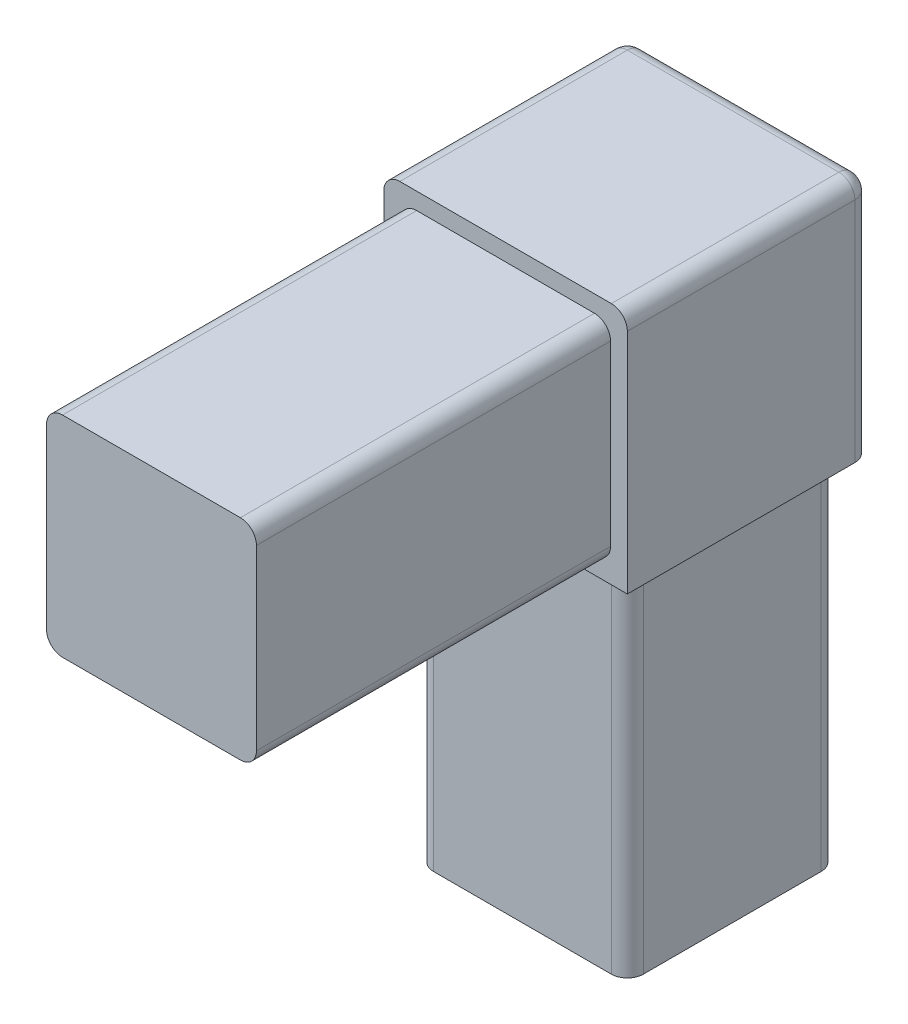
ISO-10303-21;
HEADER;
FILE_DESCRIPTION(('STEP AP214'),'2;1');
FILE_NAME('part.step','',(''),(''),'','','');
FILE_SCHEMA(('AUTOMOTIVE_DESIGN { 1 0 10303 214 1 1 1 1 }'));
ENDSEC;
DATA;
#1=APPLICATION_CONTEXT('core data for automotive mechanical design processes');
#2=APPLICATION_PROTOCOL_DEFINITION('international standard','automotive_design',2000,#1);
#3=PRODUCT_CONTEXT('',#1,'mechanical');
#4=PRODUCT('Part','Part','',(#3));
#5=PRODUCT_RELATED_PRODUCT_CATEGORY('part','',(#4));
#6=PRODUCT_DEFINITION_FORMATION('','',#4);
#7=PRODUCT_DEFINITION_CONTEXT('part definition',#1,'design');
#8=PRODUCT_DEFINITION('design','',#6,#7);
#9=PRODUCT_DEFINITION_SHAPE('','',#8);
#10=(LENGTH_UNIT() NAMED_UNIT(*) SI_UNIT(.MILLI.,.METRE.));
#11=(NAMED_UNIT(*) PLANE_ANGLE_UNIT() SI_UNIT($,.RADIAN.));
#12=(NAMED_UNIT(*) SI_UNIT($,.STERADIAN.) SOLID_ANGLE_UNIT());
#13=UNCERTAINTY_MEASURE_WITH_UNIT(LENGTH_MEASURE(1.E-05),#10,'distance_accuracy_value','');
#14=(GEOMETRIC_REPRESENTATION_CONTEXT(3) GLOBAL_UNCERTAINTY_ASSIGNED_CONTEXT((#13)) GLOBAL_UNIT_ASSIGNED_CONTEXT((#10,
#11,#12)) REPRESENTATION_CONTEXT('',''));
#15=CARTESIAN_POINT('',(0.,0.,0.));
#16=DIRECTION('',(0.,0.,1.));
#17=DIRECTION('',(1.,0.,0.));
#18=AXIS2_PLACEMENT_3D('',#15,#16,#17);
#19=CARTESIAN_POINT('',(-9.652,47.371,9.652));
#20=DIRECTION('',(0.,0.,-1.));
#21=DIRECTION('',(-1.,0.,0.));
#22=AXIS2_PLACEMENT_3D('',#19,#20,#21);
#23=PLANE('',#22);
#24=DIRECTION('',(1.,0.,0.));
#25=VECTOR('',#24,1.);
#26=CARTESIAN_POINT('',(-9.652,47.371,9.652));
#27=LINE('',#26,#25);
#28=CARTESIAN_POINT('',(-8.382,47.371,9.652));
#29=VERTEX_POINT('',#28);
#30=CARTESIAN_POINT('',(8.382,47.371,9.652));
#31=VERTEX_POINT('',#30);
#32=EDGE_CURVE('E225',#29,#31,#27,.T.);
#33=ORIENTED_EDGE('',*,*,#32,.F.);
#34=CARTESIAN_POINT('',(-8.382,46.101,9.652));
#35=DIRECTION('',(0.,0.,-1.));
#36=DIRECTION('',(-1.,0.,0.));
#37=AXIS2_PLACEMENT_3D('',#34,#35,#36);
#38=CIRCLE('',#37,1.27);
#39=CARTESIAN_POINT('',(-9.652,46.101,9.652));
#40=VERTEX_POINT('',#39);
#41=EDGE_CURVE('E217',#29,#40,#38,.F.);
#42=ORIENTED_EDGE('',*,*,#41,.T.);
#43=DIRECTION('',(0.,-1.,0.));
#44=VECTOR('',#43,1.);
#45=CARTESIAN_POINT('',(-9.652,47.371,9.652));
#46=LINE('',#45,#44);
#47=CARTESIAN_POINT('',(-9.652,28.067,9.652));
#48=VERTEX_POINT('',#47);
#49=EDGE_CURVE('E201',#40,#48,#46,.T.);
#50=ORIENTED_EDGE('',*,*,#49,.T.);
#51=DIRECTION('',(1.,0.,0.));
#52=VECTOR('',#51,1.);
#53=CARTESIAN_POINT('',(-9.652,28.067,9.652));
#54=LINE('',#53,#52);
#55=CARTESIAN_POINT('',(9.652,28.067,9.652));
#56=VERTEX_POINT('',#55);
#57=EDGE_CURVE('E208',#48,#56,#54,.T.);
#58=ORIENTED_EDGE('',*,*,#57,.T.);
#59=DIRECTION('',(0.,-1.,0.));
#60=VECTOR('',#59,1.);
#61=CARTESIAN_POINT('',(9.652,47.371,9.652));
#62=LINE('',#61,#60);
#63=CARTESIAN_POINT('',(9.652,46.101,9.652));
#64=VERTEX_POINT('',#63);
#65=EDGE_CURVE('E219',#64,#56,#62,.T.);
#66=ORIENTED_EDGE('',*,*,#65,.F.);
#67=CARTESIAN_POINT('',(8.382,46.101,9.652));
#68=DIRECTION('',(0.,0.,-1.));
#69=DIRECTION('',(-1.,0.,0.));
#70=AXIS2_PLACEMENT_3D('',#67,#68,#69);
#71=CIRCLE('',#70,1.27);
#72=EDGE_CURVE('E262',#64,#31,#71,.F.);
#73=ORIENTED_EDGE('',*,*,#72,.T.);
#74=EDGE_LOOP('',(#33,#42,#50,#58,#66,#73));
#75=FACE_BOUND('',#74,.T.);
#76=DIRECTION('',(0.,1.,0.));
#77=VECTOR('',#76,1.);
#78=CARTESIAN_POINT('',(8.3185,29.4005,9.652));
#79=LINE('',#78,#77);
#80=CARTESIAN_POINT('',(8.3185,30.6705,9.652));
#81=VERTEX_POINT('',#80);
#82=CARTESIAN_POINT('',(8.3185,44.7675,9.652));
#83=VERTEX_POINT('',#82);
#84=EDGE_CURVE('E366',#81,#83,#79,.T.);
#85=ORIENTED_EDGE('',*,*,#84,.F.);
#86=CARTESIAN_POINT('',(7.0485,30.6705,9.652));
#87=DIRECTION('',(0.,0.,-1.));
#88=DIRECTION('',(-1.,0.,0.));
#89=AXIS2_PLACEMENT_3D('',#86,#87,#88);
#90=CIRCLE('',#89,1.27);
#91=CARTESIAN_POINT('',(7.0485,29.4005,9.652));
#92=VERTEX_POINT('',#91);
#93=EDGE_CURVE('E43',#81,#92,#90,.T.);
#94=ORIENTED_EDGE('',*,*,#93,.T.);
#95=DIRECTION('',(1.,0.,0.));
#96=VECTOR('',#95,1.);
#97=CARTESIAN_POINT('',(-8.3185,29.4005,9.652));
#98=LINE('',#97,#96);
#99=CARTESIAN_POINT('',(-7.0485,29.4005,9.652));
#100=VERTEX_POINT('',#99);
#101=EDGE_CURVE('E382',#100,#92,#98,.T.);
#102=ORIENTED_EDGE('',*,*,#101,.F.);
#103=CARTESIAN_POINT('',(-7.0485,30.6705,9.652));
#104=DIRECTION('',(0.,0.,-1.));
#105=DIRECTION('',(-1.,0.,0.));
#106=AXIS2_PLACEMENT_3D('',#103,#104,#105);
#107=CIRCLE('',#106,1.27);
#108=CARTESIAN_POINT('',(-8.3185,30.6705,9.652));
#109=VERTEX_POINT('',#108);
#110=EDGE_CURVE('E344',#100,#109,#107,.T.);
#111=ORIENTED_EDGE('',*,*,#110,.T.);
#112=DIRECTION('',(0.,-1.,0.));
#113=VECTOR('',#112,1.);
#114=CARTESIAN_POINT('',(-8.3185,29.4005,9.652));
#115=LINE('',#114,#113);
#116=CARTESIAN_POINT('',(-8.3185,44.7675,9.652));
#117=VERTEX_POINT('',#116);
#118=EDGE_CURVE('E374',#117,#109,#115,.T.);
#119=ORIENTED_EDGE('',*,*,#118,.F.);
#120=CARTESIAN_POINT('',(-7.0485,44.7675,9.652));
#121=DIRECTION('',(0.,0.,-1.));
#122=DIRECTION('',(-1.,0.,0.));
#123=AXIS2_PLACEMENT_3D('',#120,#121,#122);
#124=CIRCLE('',#123,1.27);
#125=CARTESIAN_POINT('',(-7.0485,46.0375,9.652));
#126=VERTEX_POINT('',#125);
#127=EDGE_CURVE('E346',#117,#126,#124,.T.);
#128=ORIENTED_EDGE('',*,*,#127,.T.);
#129=DIRECTION('',(-1.,0.,0.));
#130=VECTOR('',#129,1.);
#131=CARTESIAN_POINT('',(-8.3185,46.0375,9.652));
#132=LINE('',#131,#130);
#133=CARTESIAN_POINT('',(7.0485,46.0375,9.652));
#134=VERTEX_POINT('',#133);
#135=EDGE_CURVE('E369',#134,#126,#132,.T.);
#136=ORIENTED_EDGE('',*,*,#135,.F.);
#137=CARTESIAN_POINT('',(7.0485,44.7675,9.652));
#138=DIRECTION('',(0.,0.,-1.));
#139=DIRECTION('',(-1.,0.,0.));
#140=AXIS2_PLACEMENT_3D('',#137,#138,#139);
#141=CIRCLE('',#140,1.27);
#142=EDGE_CURVE('E11',#134,#83,#141,.T.);
#143=ORIENTED_EDGE('',*,*,#142,.T.);
#144=EDGE_LOOP('',(#85,#94,#102,#111,#119,#128,#136,#143));
#145=FACE_BOUND('',#144,.T.);
#146=ADVANCED_FACE('F34',(#75,#145),#23,.F.);
#147=CARTESIAN_POINT('',(8.3185,28.067,-8.3185));
#148=DIRECTION('',(-1.,0.,0.));
#149=DIRECTION('',(0.,0.,1.));
#150=AXIS2_PLACEMENT_3D('',#147,#148,#149);
#151=PLANE('',#150);
#152=DIRECTION('',(0.,0.,-1.));
#153=VECTOR('',#152,1.);
#154=CARTESIAN_POINT('',(8.3185,28.067,-8.3185));
#155=LINE('',#154,#153);
#156=CARTESIAN_POINT('',(8.3185,28.067,7.0485));
#157=VERTEX_POINT('',#156);
#158=CARTESIAN_POINT('',(8.3185,28.067,-7.0485));
#159=VERTEX_POINT('',#158);
#160=EDGE_CURVE('E232',#157,#159,#155,.T.);
#161=ORIENTED_EDGE('',*,*,#160,.F.);
#162=DIRECTION('',(0.,-1.,0.));
#163=VECTOR('',#162,1.);
#164=CARTESIAN_POINT('',(8.3185,28.067,7.0485));
#165=LINE('',#164,#163);
#166=CARTESIAN_POINT('',(8.3185,0.,7.0485));
#167=VERTEX_POINT('',#166);
#168=EDGE_CURVE('E302',#157,#167,#165,.T.);
#169=ORIENTED_EDGE('',*,*,#168,.T.);
#170=DIRECTION('',(0.,0.,-1.));
#171=VECTOR('',#170,1.);
#172=CARTESIAN_POINT('',(8.3185,0.,-8.3185));
#173=LINE('',#172,#171);
#174=CARTESIAN_POINT('',(8.3185,0.,-7.0485));
#175=VERTEX_POINT('',#174);
#176=EDGE_CURVE('E218',#167,#175,#173,.T.);
#177=ORIENTED_EDGE('',*,*,#176,.T.);
#178=DIRECTION('',(0.,-1.,0.));
#179=VECTOR('',#178,1.);
#180=CARTESIAN_POINT('',(8.3185,28.067,-7.0485));
#181=LINE('',#180,#179);
#182=EDGE_CURVE('E300',#175,#159,#181,.F.);
#183=ORIENTED_EDGE('',*,*,#182,.T.);
#184=EDGE_LOOP('',(#161,#169,#177,#183));
#185=FACE_BOUND('',#184,.T.);
#186=ADVANCED_FACE('F432',(#185),#151,.F.);
#187=CARTESIAN_POINT('',(-8.3185,28.067,-8.3185));
#188=DIRECTION('',(0.,0.,1.));
#189=DIRECTION('',(1.,0.,0.));
#190=AXIS2_PLACEMENT_3D('',#187,#188,#189);
#191=PLANE('',#190);
#192=DIRECTION('',(-1.,0.,0.));
#193=VECTOR('',#192,1.);
#194=CARTESIAN_POINT('',(-8.3185,0.,-8.3185));
#195=LINE('',#194,#193);
#196=CARTESIAN_POINT('',(7.0485,0.,-8.3185));
#197=VERTEX_POINT('',#196);
#198=CARTESIAN_POINT('',(-7.0485,0.,-8.3185));
#199=VERTEX_POINT('',#198);
#200=EDGE_CURVE('E248',#197,#199,#195,.T.);
#201=ORIENTED_EDGE('',*,*,#200,.T.);
#202=DIRECTION('',(0.,-1.,0.));
#203=VECTOR('',#202,1.);
#204=CARTESIAN_POINT('',(-7.0485,28.067,-8.3185));
#205=LINE('',#204,#203);
#206=CARTESIAN_POINT('',(-7.0485,28.067,-8.3185));
#207=VERTEX_POINT('',#206);
#208=EDGE_CURVE('E308',#199,#207,#205,.F.);
#209=ORIENTED_EDGE('',*,*,#208,.T.);
#210=DIRECTION('',(-1.,0.,0.));
#211=VECTOR('',#210,1.);
#212=CARTESIAN_POINT('',(-8.3185,28.067,-8.3185));
#213=LINE('',#212,#211);
#214=CARTESIAN_POINT('',(7.0485,28.067,-8.3185));
#215=VERTEX_POINT('',#214);
#216=EDGE_CURVE('E235',#215,#207,#213,.T.);
#217=ORIENTED_EDGE('',*,*,#216,.F.);
#218=DIRECTION('',(0.,-1.,0.));
#219=VECTOR('',#218,1.);
#220=CARTESIAN_POINT('',(7.0485,28.067,-8.3185));
#221=LINE('',#220,#219);
#222=EDGE_CURVE('E305',#215,#197,#221,.T.);
#223=ORIENTED_EDGE('',*,*,#222,.T.);
#224=EDGE_LOOP('',(#201,#209,#217,#223));
#225=FACE_BOUND('',#224,.T.);
#226=ADVANCED_FACE('F437',(#225),#191,.F.);
#227=CARTESIAN_POINT('',(-8.3185,28.067,-8.3185));
#228=DIRECTION('',(1.,0.,0.));
#229=DIRECTION('',(0.,0.,-1.));
#230=AXIS2_PLACEMENT_3D('',#227,#228,#229);
#231=PLANE('',#230);
#232=DIRECTION('',(0.,0.,1.));
#233=VECTOR('',#232,1.);
#234=CARTESIAN_POINT('',(-8.3185,0.,-8.3185));
#235=LINE('',#234,#233);
#236=CARTESIAN_POINT('',(-8.3185,0.,-7.0485));
#237=VERTEX_POINT('',#236);
#238=CARTESIAN_POINT('',(-8.3185,0.,7.0485));
#239=VERTEX_POINT('',#238);
#240=EDGE_CURVE('E251',#237,#239,#235,.T.);
#241=ORIENTED_EDGE('',*,*,#240,.T.);
#242=DIRECTION('',(0.,-1.,0.));
#243=VECTOR('',#242,1.);
#244=CARTESIAN_POINT('',(-8.3185,28.067,7.0485));
#245=LINE('',#244,#243);
#246=CARTESIAN_POINT('',(-8.3185,28.067,7.0485));
#247=VERTEX_POINT('',#246);
#248=EDGE_CURVE('E298',#239,#247,#245,.F.);
#249=ORIENTED_EDGE('',*,*,#248,.T.);
#250=DIRECTION('',(0.,0.,1.));
#251=VECTOR('',#250,1.);
#252=CARTESIAN_POINT('',(-8.3185,28.067,-8.3185));
#253=LINE('',#252,#251);
#254=CARTESIAN_POINT('',(-8.3185,28.067,-7.0485));
#255=VERTEX_POINT('',#254);
#256=EDGE_CURVE('E239',#255,#247,#253,.T.);
#257=ORIENTED_EDGE('',*,*,#256,.F.);
#258=DIRECTION('',(0.,-1.,0.));
#259=VECTOR('',#258,1.);
#260=CARTESIAN_POINT('',(-8.3185,28.067,-7.0485));
#261=LINE('',#260,#259);
#262=EDGE_CURVE('E295',#255,#237,#261,.T.);
#263=ORIENTED_EDGE('',*,*,#262,.T.);
#264=EDGE_LOOP('',(#241,#249,#257,#263));
#265=FACE_BOUND('',#264,.T.);
#266=ADVANCED_FACE('F455',(#265),#231,.F.);
#267=CARTESIAN_POINT('',(-8.3185,28.067,8.3185));
#268=DIRECTION('',(0.,0.,-1.));
#269=DIRECTION('',(-1.,0.,0.));
#270=AXIS2_PLACEMENT_3D('',#267,#268,#269);
#271=PLANE('',#270);
#272=DIRECTION('',(1.,0.,0.));
#273=VECTOR('',#272,1.);
#274=CARTESIAN_POINT('',(-8.3185,28.067,8.3185));
#275=LINE('',#274,#273);
#276=CARTESIAN_POINT('',(-7.0485,28.067,8.3185));
#277=VERTEX_POINT('',#276);
#278=CARTESIAN_POINT('',(7.0485,28.067,8.3185));
#279=VERTEX_POINT('',#278);
#280=EDGE_CURVE('E242',#277,#279,#275,.T.);
#281=ORIENTED_EDGE('',*,*,#280,.F.);
#282=DIRECTION('',(0.,-1.,0.));
#283=VECTOR('',#282,1.);
#284=CARTESIAN_POINT('',(-7.0485,28.067,8.3185));
#285=LINE('',#284,#283);
#286=CARTESIAN_POINT('',(-7.0485,0.,8.3185));
#287=VERTEX_POINT('',#286);
#288=EDGE_CURVE('E284',#277,#287,#285,.T.);
#289=ORIENTED_EDGE('',*,*,#288,.T.);
#290=DIRECTION('',(1.,0.,0.));
#291=VECTOR('',#290,1.);
#292=CARTESIAN_POINT('',(-8.3185,0.,8.3185));
#293=LINE('',#292,#291);
#294=CARTESIAN_POINT('',(7.0485,0.,8.3185));
#295=VERTEX_POINT('',#294);
#296=EDGE_CURVE('E236',#287,#295,#293,.T.);
#297=ORIENTED_EDGE('',*,*,#296,.T.);
#298=DIRECTION('',(0.,-1.,0.));
#299=VECTOR('',#298,1.);
#300=CARTESIAN_POINT('',(7.0485,28.067,8.3185));
#301=LINE('',#300,#299);
#302=EDGE_CURVE('E282',#295,#279,#301,.F.);
#303=ORIENTED_EDGE('',*,*,#302,.T.);
#304=EDGE_LOOP('',(#281,#289,#297,#303));
#305=FACE_BOUND('',#304,.T.);
#306=ADVANCED_FACE('F451',(#305),#271,.F.);
#307=CARTESIAN_POINT('',(0.,0.,0.));
#308=DIRECTION('',(0.,1.,0.));
#309=DIRECTION('',(0.,0.,1.));
#310=AXIS2_PLACEMENT_3D('',#307,#308,#309);
#311=PLANE('',#310);
#312=ORIENTED_EDGE('',*,*,#296,.F.);
#313=CARTESIAN_POINT('',(-7.0485,0.,7.0485));
#314=DIRECTION('',(0.,1.,0.));
#315=DIRECTION('',(0.,0.,1.));
#316=AXIS2_PLACEMENT_3D('',#313,#314,#315);
#317=CIRCLE('',#316,1.27);
#318=EDGE_CURVE('E293',#287,#239,#317,.F.);
#319=ORIENTED_EDGE('',*,*,#318,.T.);
#320=ORIENTED_EDGE('',*,*,#240,.F.);
#321=CARTESIAN_POINT('',(-7.0485,0.,-7.0485));
#322=DIRECTION('',(0.,1.,0.));
#323=DIRECTION('',(0.,0.,1.));
#324=AXIS2_PLACEMENT_3D('',#321,#322,#323);
#325=CIRCLE('',#324,1.27);
#326=EDGE_CURVE('E289',#237,#199,#325,.F.);
#327=ORIENTED_EDGE('',*,*,#326,.T.);
#328=ORIENTED_EDGE('',*,*,#200,.F.);
#329=CARTESIAN_POINT('',(7.0485,0.,-7.0485));
#330=DIRECTION('',(0.,1.,0.));
#331=DIRECTION('',(0.,0.,1.));
#332=AXIS2_PLACEMENT_3D('',#329,#330,#331);
#333=CIRCLE('',#332,1.27);
#334=EDGE_CURVE('E287',#197,#175,#333,.F.);
#335=ORIENTED_EDGE('',*,*,#334,.T.);
#336=ORIENTED_EDGE('',*,*,#176,.F.);
#337=CARTESIAN_POINT('',(7.0485,0.,7.0485));
#338=DIRECTION('',(0.,1.,0.));
#339=DIRECTION('',(0.,0.,1.));
#340=AXIS2_PLACEMENT_3D('',#337,#338,#339);
#341=CIRCLE('',#340,1.27);
#342=EDGE_CURVE('E291',#167,#295,#341,.F.);
#343=ORIENTED_EDGE('',*,*,#342,.T.);
#344=EDGE_LOOP('',(#312,#319,#320,#327,#328,#335,#336,#343));
#345=FACE_BOUND('',#344,.T.);
#346=ADVANCED_FACE('F448',(#345),#311,.F.);
#347=CARTESIAN_POINT('',(0.,28.067,0.));
#348=DIRECTION('',(0.,-1.,0.));
#349=DIRECTION('',(0.,0.,-1.));
#350=AXIS2_PLACEMENT_3D('',#347,#348,#349);
#351=PLANE('',#350);
#352=DIRECTION('',(0.,0.,1.));
#353=VECTOR('',#352,1.);
#354=CARTESIAN_POINT('',(-9.652,28.067,9.652));
#355=LINE('',#354,#353);
#356=CARTESIAN_POINT('',(-9.652,28.067,-8.382));
#357=VERTEX_POINT('',#356);
#358=EDGE_CURVE('E198',#357,#48,#355,.T.);
#359=ORIENTED_EDGE('',*,*,#358,.F.);
#360=CARTESIAN_POINT('',(-8.382,28.067,-8.382));
#361=DIRECTION('',(0.,-1.,0.));
#362=DIRECTION('',(0.,0.,-1.));
#363=AXIS2_PLACEMENT_3D('',#360,#361,#362);
#364=CIRCLE('',#363,1.27);
#365=CARTESIAN_POINT('',(-8.382,28.067,-9.652));
#366=VERTEX_POINT('',#365);
#367=EDGE_CURVE('E270',#357,#366,#364,.T.);
#368=ORIENTED_EDGE('',*,*,#367,.T.);
#369=DIRECTION('',(-1.,0.,0.));
#370=VECTOR('',#369,1.);
#371=CARTESIAN_POINT('',(-9.652,28.067,-9.652));
#372=LINE('',#371,#370);
#373=CARTESIAN_POINT('',(8.382,28.067,-9.652));
#374=VERTEX_POINT('',#373);
#375=EDGE_CURVE('E209',#374,#366,#372,.T.);
#376=ORIENTED_EDGE('',*,*,#375,.F.);
#377=CARTESIAN_POINT('',(8.382,28.067,-8.382));
#378=DIRECTION('',(0.,-1.,0.));
#379=DIRECTION('',(0.,0.,-1.));
#380=AXIS2_PLACEMENT_3D('',#377,#378,#379);
#381=CIRCLE('',#380,1.27);
#382=CARTESIAN_POINT('',(9.652,28.067,-8.382));
#383=VERTEX_POINT('',#382);
#384=EDGE_CURVE('E268',#374,#383,#381,.T.);
#385=ORIENTED_EDGE('',*,*,#384,.T.);
#386=DIRECTION('',(0.,0.,-1.));
#387=VECTOR('',#386,1.);
#388=CARTESIAN_POINT('',(9.652,28.067,9.652));
#389=LINE('',#388,#387);
#390=EDGE_CURVE('E224',#56,#383,#389,.T.);
#391=ORIENTED_EDGE('',*,*,#390,.F.);
#392=ORIENTED_EDGE('',*,*,#57,.F.);
#393=EDGE_LOOP('',(#359,#368,#376,#385,#391,#392));
#394=FACE_BOUND('',#393,.T.);
#395=ORIENTED_EDGE('',*,*,#280,.T.);
#396=CARTESIAN_POINT('',(7.0485,28.067,7.0485));
#397=DIRECTION('',(0.,-1.,0.));
#398=DIRECTION('',(0.,0.,-1.));
#399=AXIS2_PLACEMENT_3D('',#396,#397,#398);
#400=CIRCLE('',#399,1.27);
#401=EDGE_CURVE('E338',#279,#157,#400,.F.);
#402=ORIENTED_EDGE('',*,*,#401,.T.);
#403=ORIENTED_EDGE('',*,*,#160,.T.);
#404=CARTESIAN_POINT('',(7.0485,28.067,-7.0485));
#405=DIRECTION('',(0.,-1.,0.));
#406=DIRECTION('',(0.,0.,-1.));
#407=AXIS2_PLACEMENT_3D('',#404,#405,#406);
#408=CIRCLE('',#407,1.27);
#409=EDGE_CURVE('E342',#159,#215,#408,.F.);
#410=ORIENTED_EDGE('',*,*,#409,.T.);
#411=ORIENTED_EDGE('',*,*,#216,.T.);
#412=CARTESIAN_POINT('',(-7.0485,28.067,-7.0485));
#413=DIRECTION('',(0.,-1.,0.));
#414=DIRECTION('',(0.,0.,-1.));
#415=AXIS2_PLACEMENT_3D('',#412,#413,#414);
#416=CIRCLE('',#415,1.27);
#417=EDGE_CURVE('E340',#207,#255,#416,.F.);
#418=ORIENTED_EDGE('',*,*,#417,.T.);
#419=ORIENTED_EDGE('',*,*,#256,.T.);
#420=CARTESIAN_POINT('',(-7.0485,28.067,7.0485));
#421=DIRECTION('',(0.,-1.,0.));
#422=DIRECTION('',(0.,0.,-1.));
#423=AXIS2_PLACEMENT_3D('',#420,#421,#422);
#424=CIRCLE('',#423,1.27);
#425=EDGE_CURVE('E336',#247,#277,#424,.F.);
#426=ORIENTED_EDGE('',*,*,#425,.T.);
#427=EDGE_LOOP('',(#395,#402,#403,#410,#411,#418,#419,#426));
#428=FACE_BOUND('',#427,.T.);
#429=ADVANCED_FACE('F221',(#394,#428),#351,.T.);
#430=CARTESIAN_POINT('',(9.652,47.371,9.652));
#431=DIRECTION('',(-1.,0.,0.));
#432=DIRECTION('',(0.,0.,1.));
#433=AXIS2_PLACEMENT_3D('',#430,#431,#432);
#434=PLANE('',#433);
#435=ORIENTED_EDGE('',*,*,#390,.T.);
#436=DIRECTION('',(0.,-1.,0.));
#437=VECTOR('',#436,1.);
#438=CARTESIAN_POINT('',(9.652,47.371,-8.382));
#439=LINE('',#438,#437);
#440=CARTESIAN_POINT('',(9.652,46.101,-8.382));
#441=VERTEX_POINT('',#440);
#442=EDGE_CURVE('E280',#383,#441,#439,.F.);
#443=ORIENTED_EDGE('',*,*,#442,.T.);
#444=DIRECTION('',(0.,0.,-1.));
#445=VECTOR('',#444,1.);
#446=CARTESIAN_POINT('',(9.652,46.101,9.652));
#447=LINE('',#446,#445);
#448=EDGE_CURVE('E278',#441,#64,#447,.F.);
#449=ORIENTED_EDGE('',*,*,#448,.T.);
#450=ORIENTED_EDGE('',*,*,#65,.T.);
#451=EDGE_LOOP('',(#435,#443,#449,#450));
#452=FACE_BOUND('',#451,.T.);
#453=ADVANCED_FACE('F409',(#452),#434,.F.);
#454=CARTESIAN_POINT('',(-9.652,47.371,-9.652));
#455=DIRECTION('',(0.,0.,1.));
#456=DIRECTION('',(1.,0.,0.));
#457=AXIS2_PLACEMENT_3D('',#454,#455,#456);
#458=PLANE('',#457);
#459=ORIENTED_EDGE('',*,*,#375,.T.);
#460=DIRECTION('',(0.,-1.,0.));
#461=VECTOR('',#460,1.);
#462=CARTESIAN_POINT('',(-8.382,47.371,-9.652));
#463=LINE('',#462,#461);
#464=CARTESIAN_POINT('',(-8.382,46.101,-9.652));
#465=VERTEX_POINT('',#464);
#466=EDGE_CURVE('E276',#366,#465,#463,.F.);
#467=ORIENTED_EDGE('',*,*,#466,.T.);
#468=DIRECTION('',(-1.,0.,0.));
#469=VECTOR('',#468,1.);
#470=CARTESIAN_POINT('',(-9.652,46.101,-9.652));
#471=LINE('',#470,#469);
#472=CARTESIAN_POINT('',(8.382,46.101,-9.652));
#473=VERTEX_POINT('',#472);
#474=EDGE_CURVE('E272',#465,#473,#471,.F.);
#475=ORIENTED_EDGE('',*,*,#474,.T.);
#476=DIRECTION('',(0.,-1.,0.));
#477=VECTOR('',#476,1.);
#478=CARTESIAN_POINT('',(8.382,47.371,-9.652));
#479=LINE('',#478,#477);
#480=EDGE_CURVE('E274',#473,#374,#479,.T.);
#481=ORIENTED_EDGE('',*,*,#480,.T.);
#482=EDGE_LOOP('',(#459,#467,#475,#481));
#483=FACE_BOUND('',#482,.T.);
#484=ADVANCED_FACE('F390',(#483),#458,.F.);
#485=CARTESIAN_POINT('',(-9.652,47.371,9.652));
#486=DIRECTION('',(1.,0.,0.));
#487=DIRECTION('',(0.,0.,-1.));
#488=AXIS2_PLACEMENT_3D('',#485,#486,#487);
#489=PLANE('',#488);
#490=ORIENTED_EDGE('',*,*,#49,.F.);
#491=DIRECTION('',(0.,0.,1.));
#492=VECTOR('',#491,1.);
#493=CARTESIAN_POINT('',(-9.652,46.101,9.652));
#494=LINE('',#493,#492);
#495=CARTESIAN_POINT('',(-9.652,46.101,-8.382));
#496=VERTEX_POINT('',#495);
#497=EDGE_CURVE('E266',#40,#496,#494,.F.);
#498=ORIENTED_EDGE('',*,*,#497,.T.);
#499=DIRECTION('',(0.,-1.,0.));
#500=VECTOR('',#499,1.);
#501=CARTESIAN_POINT('',(-9.652,47.371,-8.382));
#502=LINE('',#501,#500);
#503=EDGE_CURVE('E204',#496,#357,#502,.T.);
#504=ORIENTED_EDGE('',*,*,#503,.T.);
#505=ORIENTED_EDGE('',*,*,#358,.T.);
#506=EDGE_LOOP('',(#490,#498,#504,#505));
#507=FACE_BOUND('',#506,.T.);
#508=ADVANCED_FACE('F200',(#507),#489,.F.);
#509=CARTESIAN_POINT('',(0.,47.371,0.));
#510=DIRECTION('',(0.,-1.,0.));
#511=DIRECTION('',(0.,0.,-1.));
#512=AXIS2_PLACEMENT_3D('',#509,#510,#511);
#513=PLANE('',#512);
#514=DIRECTION('',(-1.,0.,0.));
#515=VECTOR('',#514,1.);
#516=CARTESIAN_POINT('',(0.,47.371,-8.382));
#517=LINE('',#516,#515);
#518=CARTESIAN_POINT('',(8.382,47.371,-8.382));
#519=VERTEX_POINT('',#518);
#520=CARTESIAN_POINT('',(-8.382,47.371,-8.382));
#521=VERTEX_POINT('',#520);
#522=EDGE_CURVE('E257',#519,#521,#517,.T.);
#523=ORIENTED_EDGE('',*,*,#522,.T.);
#524=DIRECTION('',(0.,0.,1.));
#525=VECTOR('',#524,1.);
#526=CARTESIAN_POINT('',(-8.382,47.371,0.));
#527=LINE('',#526,#525);
#528=EDGE_CURVE('E259',#521,#29,#527,.T.);
#529=ORIENTED_EDGE('',*,*,#528,.T.);
#530=ORIENTED_EDGE('',*,*,#32,.T.);
#531=DIRECTION('',(0.,0.,-1.));
#532=VECTOR('',#531,1.);
#533=CARTESIAN_POINT('',(8.382,47.371,0.));
#534=LINE('',#533,#532);
#535=EDGE_CURVE('E245',#31,#519,#534,.T.);
#536=ORIENTED_EDGE('',*,*,#535,.T.);
#537=EDGE_LOOP('',(#523,#529,#530,#536));
#538=FACE_BOUND('',#537,.T.);
#539=ADVANCED_FACE('F416',(#538),#513,.F.);
#540=CARTESIAN_POINT('',(8.3185,29.4005,37.719));
#541=DIRECTION('',(-1.,0.,0.));
#542=DIRECTION('',(0.,0.,1.));
#543=AXIS2_PLACEMENT_3D('',#540,#541,#542);
#544=PLANE('',#543);
#545=DIRECTION('',(0.,1.,0.));
#546=VECTOR('',#545,1.);
#547=CARTESIAN_POINT('',(8.3185,29.4005,37.719));
#548=LINE('',#547,#546);
#549=CARTESIAN_POINT('',(8.3185,30.6705,37.719));
#550=VERTEX_POINT('',#549);
#551=CARTESIAN_POINT('',(8.3185,44.7675,37.719));
#552=VERTEX_POINT('',#551);
#553=EDGE_CURVE('E384',#550,#552,#548,.T.);
#554=ORIENTED_EDGE('',*,*,#553,.F.);
#555=DIRECTION('',(0.,0.,-1.));
#556=VECTOR('',#555,1.);
#557=CARTESIAN_POINT('',(8.3185,30.6705,37.719));
#558=LINE('',#557,#556);
#559=EDGE_CURVE('E333',#550,#81,#558,.T.);
#560=ORIENTED_EDGE('',*,*,#559,.T.);
#561=ORIENTED_EDGE('',*,*,#84,.T.);
#562=DIRECTION('',(0.,0.,-1.));
#563=VECTOR('',#562,1.);
#564=CARTESIAN_POINT('',(8.3185,44.7675,37.719));
#565=LINE('',#564,#563);
#566=EDGE_CURVE('E331',#83,#552,#565,.F.);
#567=ORIENTED_EDGE('',*,*,#566,.T.);
#568=EDGE_LOOP('',(#554,#560,#561,#567));
#569=FACE_BOUND('',#568,.T.);
#570=ADVANCED_FACE('F519',(#569),#544,.F.);
#571=CARTESIAN_POINT('',(-8.3185,46.0375,37.719));
#572=DIRECTION('',(0.,-1.,0.));
#573=DIRECTION('',(0.,0.,-1.));
#574=AXIS2_PLACEMENT_3D('',#571,#572,#573);
#575=PLANE('',#574);
#576=ORIENTED_EDGE('',*,*,#135,.T.);
#577=DIRECTION('',(0.,0.,-1.));
#578=VECTOR('',#577,1.);
#579=CARTESIAN_POINT('',(-7.0485,46.0375,37.719));
#580=LINE('',#579,#578);
#581=CARTESIAN_POINT('',(-7.0485,46.0375,37.719));
#582=VERTEX_POINT('',#581);
#583=EDGE_CURVE('E51',#126,#582,#580,.F.);
#584=ORIENTED_EDGE('',*,*,#583,.T.);
#585=DIRECTION('',(-1.,0.,0.));
#586=VECTOR('',#585,1.);
#587=CARTESIAN_POINT('',(-8.3185,46.0375,37.719));
#588=LINE('',#587,#586);
#589=CARTESIAN_POINT('',(7.0485,46.0375,37.719));
#590=VERTEX_POINT('',#589);
#591=EDGE_CURVE('E520',#590,#582,#588,.T.);
#592=ORIENTED_EDGE('',*,*,#591,.F.);
#593=DIRECTION('',(0.,0.,-1.));
#594=VECTOR('',#593,1.);
#595=CARTESIAN_POINT('',(7.0485,46.0375,37.719));
#596=LINE('',#595,#594);
#597=EDGE_CURVE('E327',#590,#134,#596,.T.);
#598=ORIENTED_EDGE('',*,*,#597,.T.);
#599=EDGE_LOOP('',(#576,#584,#592,#598));
#600=FACE_BOUND('',#599,.T.);
#601=ADVANCED_FACE('F537',(#600),#575,.F.);
#602=CARTESIAN_POINT('',(-8.3185,29.4005,37.719));
#603=DIRECTION('',(1.,0.,0.));
#604=DIRECTION('',(0.,0.,-1.));
#605=AXIS2_PLACEMENT_3D('',#602,#603,#604);
#606=PLANE('',#605);
#607=ORIENTED_EDGE('',*,*,#118,.T.);
#608=DIRECTION('',(0.,0.,-1.));
#609=VECTOR('',#608,1.);
#610=CARTESIAN_POINT('',(-8.3185,30.6705,37.719));
#611=LINE('',#610,#609);
#612=CARTESIAN_POINT('',(-8.3185,30.6705,37.719));
#613=VERTEX_POINT('',#612);
#614=EDGE_CURVE('E318',#109,#613,#611,.F.);
#615=ORIENTED_EDGE('',*,*,#614,.T.);
#616=DIRECTION('',(0.,-1.,0.));
#617=VECTOR('',#616,1.);
#618=CARTESIAN_POINT('',(-8.3185,29.4005,37.719));
#619=LINE('',#618,#617);
#620=CARTESIAN_POINT('',(-8.3185,44.7675,37.719));
#621=VERTEX_POINT('',#620);
#622=EDGE_CURVE('E522',#621,#613,#619,.T.);
#623=ORIENTED_EDGE('',*,*,#622,.F.);
#624=DIRECTION('',(0.,0.,-1.));
#625=VECTOR('',#624,1.);
#626=CARTESIAN_POINT('',(-8.3185,44.7675,37.719));
#627=LINE('',#626,#625);
#628=EDGE_CURVE('E315',#621,#117,#627,.T.);
#629=ORIENTED_EDGE('',*,*,#628,.T.);
#630=EDGE_LOOP('',(#607,#615,#623,#629));
#631=FACE_BOUND('',#630,.T.);
#632=ADVANCED_FACE('F538',(#631),#606,.F.);
#633=CARTESIAN_POINT('',(-8.3185,29.4005,37.719));
#634=DIRECTION('',(0.,1.,0.));
#635=DIRECTION('',(0.,0.,1.));
#636=AXIS2_PLACEMENT_3D('',#633,#634,#635);
#637=PLANE('',#636);
#638=DIRECTION('',(1.,0.,0.));
#639=VECTOR('',#638,1.);
#640=CARTESIAN_POINT('',(-8.3185,29.4005,37.719));
#641=LINE('',#640,#639);
#642=CARTESIAN_POINT('',(-7.0485,29.4005,37.719));
#643=VERTEX_POINT('',#642);
#644=CARTESIAN_POINT('',(7.0485,29.4005,37.719));
#645=VERTEX_POINT('',#644);
#646=EDGE_CURVE('E377',#643,#645,#641,.T.);
#647=ORIENTED_EDGE('',*,*,#646,.F.);
#648=DIRECTION('',(0.,0.,-1.));
#649=VECTOR('',#648,1.);
#650=CARTESIAN_POINT('',(-7.0485,29.4005,37.719));
#651=LINE('',#650,#649);
#652=EDGE_CURVE('E312',#643,#100,#651,.T.);
#653=ORIENTED_EDGE('',*,*,#652,.T.);
#654=ORIENTED_EDGE('',*,*,#101,.T.);
#655=DIRECTION('',(0.,0.,-1.));
#656=VECTOR('',#655,1.);
#657=CARTESIAN_POINT('',(7.0485,29.4005,37.719));
#658=LINE('',#657,#656);
#659=EDGE_CURVE('E310',#92,#645,#658,.F.);
#660=ORIENTED_EDGE('',*,*,#659,.T.);
#661=EDGE_LOOP('',(#647,#653,#654,#660));
#662=FACE_BOUND('',#661,.T.);
#663=ADVANCED_FACE('F533',(#662),#637,.F.);
#664=CARTESIAN_POINT('',(0.,0.,37.719));
#665=DIRECTION('',(0.,0.,-1.));
#666=DIRECTION('',(-1.,0.,0.));
#667=AXIS2_PLACEMENT_3D('',#664,#665,#666);
#668=PLANE('',#667);
#669=ORIENTED_EDGE('',*,*,#622,.T.);
#670=CARTESIAN_POINT('',(-7.0485,30.6705,37.719));
#671=DIRECTION('',(0.,0.,-1.));
#672=DIRECTION('',(-1.,0.,0.));
#673=AXIS2_PLACEMENT_3D('',#670,#671,#672);
#674=CIRCLE('',#673,1.27);
#675=EDGE_CURVE('E325',#613,#643,#674,.F.);
#676=ORIENTED_EDGE('',*,*,#675,.T.);
#677=ORIENTED_EDGE('',*,*,#646,.T.);
#678=CARTESIAN_POINT('',(7.0485,30.6705,37.719));
#679=DIRECTION('',(0.,0.,-1.));
#680=DIRECTION('',(-1.,0.,0.));
#681=AXIS2_PLACEMENT_3D('',#678,#679,#680);
#682=CIRCLE('',#681,1.27);
#683=EDGE_CURVE('E321',#645,#550,#682,.F.);
#684=ORIENTED_EDGE('',*,*,#683,.T.);
#685=ORIENTED_EDGE('',*,*,#553,.T.);
#686=CARTESIAN_POINT('',(7.0485,44.7675,37.719));
#687=DIRECTION('',(0.,0.,-1.));
#688=DIRECTION('',(-1.,0.,0.));
#689=AXIS2_PLACEMENT_3D('',#686,#687,#688);
#690=CIRCLE('',#689,1.27);
#691=EDGE_CURVE('E58',#552,#590,#690,.F.);
#692=ORIENTED_EDGE('',*,*,#691,.T.);
#693=ORIENTED_EDGE('',*,*,#591,.T.);
#694=CARTESIAN_POINT('',(-7.0485,44.7675,37.719));
#695=DIRECTION('',(0.,0.,-1.));
#696=DIRECTION('',(-1.,0.,0.));
#697=AXIS2_PLACEMENT_3D('',#694,#695,#696);
#698=CIRCLE('',#697,1.27);
#699=EDGE_CURVE('E323',#582,#621,#698,.F.);
#700=ORIENTED_EDGE('',*,*,#699,.T.);
#701=EDGE_LOOP('',(#669,#676,#677,#684,#685,#692,#693,#700));
#702=FACE_BOUND('',#701,.T.);
#703=ADVANCED_FACE('F517',(#702),#668,.F.);
#704=CARTESIAN_POINT('',(8.382,47.371,-8.382));
#705=DIRECTION('',(0.,-1.,0.));
#706=DIRECTION('',(0.,0.,-1.));
#707=AXIS2_PLACEMENT_3D('',#704,#705,#706);
#708=CYLINDRICAL_SURFACE('',#707,1.27);
#709=ORIENTED_EDGE('',*,*,#384,.F.);
#710=ORIENTED_EDGE('',*,*,#480,.F.);
#711=CARTESIAN_POINT('',(8.382,46.101,-8.382));
#712=DIRECTION('',(0.,1.,0.));
#713=DIRECTION('',(0.,0.,1.));
#714=AXIS2_PLACEMENT_3D('',#711,#712,#713);
#715=CIRCLE('',#714,1.27);
#716=EDGE_CURVE('E38',#441,#473,#715,.T.);
#717=ORIENTED_EDGE('',*,*,#716,.F.);
#718=ORIENTED_EDGE('',*,*,#442,.F.);
#719=EDGE_LOOP('',(#709,#710,#717,#718));
#720=FACE_BOUND('',#719,.T.);
#721=ADVANCED_FACE('F406',(#720),#708,.T.);
#722=CARTESIAN_POINT('',(8.382,46.101,0.));
#723=DIRECTION('',(0.,0.,-1.));
#724=DIRECTION('',(-1.,0.,0.));
#725=AXIS2_PLACEMENT_3D('',#722,#723,#724);
#726=CYLINDRICAL_SURFACE('',#725,1.27);
#727=ORIENTED_EDGE('',*,*,#72,.F.);
#728=ORIENTED_EDGE('',*,*,#448,.F.);
#729=CARTESIAN_POINT('',(8.382,46.101,-8.382));
#730=DIRECTION('',(0.,0.,-1.));
#731=DIRECTION('',(-1.,0.,0.));
#732=AXIS2_PLACEMENT_3D('',#729,#730,#731);
#733=CIRCLE('',#732,1.27);
#734=EDGE_CURVE('E360',#519,#441,#733,.T.);
#735=ORIENTED_EDGE('',*,*,#734,.F.);
#736=ORIENTED_EDGE('',*,*,#535,.F.);
#737=EDGE_LOOP('',(#727,#728,#735,#736));
#738=FACE_BOUND('',#737,.T.);
#739=ADVANCED_FACE('F414',(#738),#726,.T.);
#740=CARTESIAN_POINT('',(8.382,46.101,-8.382));
#741=DIRECTION('',(0.,0.,1.));
#742=DIRECTION('',(1.,0.,0.));
#743=AXIS2_PLACEMENT_3D('',#740,#741,#742);
#744=SPHERICAL_SURFACE('',#743,1.27);
#745=ORIENTED_EDGE('',*,*,#734,.T.);
#746=ORIENTED_EDGE('',*,*,#716,.T.);
#747=CARTESIAN_POINT('',(8.382,46.101,-8.382));
#748=DIRECTION('',(1.,0.,0.));
#749=DIRECTION('',(0.,0.,-1.));
#750=AXIS2_PLACEMENT_3D('',#747,#748,#749);
#751=CIRCLE('',#750,1.27);
#752=EDGE_CURVE('E358',#519,#473,#751,.F.);
#753=ORIENTED_EDGE('',*,*,#752,.F.);
#754=EDGE_LOOP('',(#745,#746,#753));
#755=FACE_BOUND('',#754,.T.);
#756=ADVANCED_FACE('F645',(#755),#744,.T.);
#757=CARTESIAN_POINT('',(-8.382,47.371,-8.382));
#758=DIRECTION('',(0.,-1.,0.));
#759=DIRECTION('',(0.,0.,-1.));
#760=AXIS2_PLACEMENT_3D('',#757,#758,#759);
#761=CYLINDRICAL_SURFACE('',#760,1.27);
#762=ORIENTED_EDGE('',*,*,#367,.F.);
#763=ORIENTED_EDGE('',*,*,#503,.F.);
#764=CARTESIAN_POINT('',(-8.382,46.101,-8.382));
#765=DIRECTION('',(0.,1.,0.));
#766=DIRECTION('',(0.,0.,1.));
#767=AXIS2_PLACEMENT_3D('',#764,#765,#766);
#768=CIRCLE('',#767,1.27);
#769=EDGE_CURVE('E355',#465,#496,#768,.T.);
#770=ORIENTED_EDGE('',*,*,#769,.F.);
#771=ORIENTED_EDGE('',*,*,#466,.F.);
#772=EDGE_LOOP('',(#762,#763,#770,#771));
#773=FACE_BOUND('',#772,.T.);
#774=ADVANCED_FACE('F396',(#773),#761,.T.);
#775=CARTESIAN_POINT('',(0.,46.101,-8.382));
#776=DIRECTION('',(-1.,0.,0.));
#777=DIRECTION('',(0.,0.,1.));
#778=AXIS2_PLACEMENT_3D('',#775,#776,#777);
#779=CYLINDRICAL_SURFACE('',#778,1.27);
#780=ORIENTED_EDGE('',*,*,#752,.T.);
#781=ORIENTED_EDGE('',*,*,#474,.F.);
#782=CARTESIAN_POINT('',(-8.382,46.101,-8.382));
#783=DIRECTION('',(-1.,0.,0.));
#784=DIRECTION('',(0.,0.,1.));
#785=AXIS2_PLACEMENT_3D('',#782,#783,#784);
#786=CIRCLE('',#785,1.27);
#787=EDGE_CURVE('E352',#521,#465,#786,.T.);
#788=ORIENTED_EDGE('',*,*,#787,.F.);
#789=ORIENTED_EDGE('',*,*,#522,.F.);
#790=EDGE_LOOP('',(#780,#781,#788,#789));
#791=FACE_BOUND('',#790,.T.);
#792=ADVANCED_FACE('F404',(#791),#779,.T.);
#793=CARTESIAN_POINT('',(-8.382,46.101,-8.382));
#794=DIRECTION('',(0.,0.,1.));
#795=DIRECTION('',(1.,0.,0.));
#796=AXIS2_PLACEMENT_3D('',#793,#794,#795);
#797=SPHERICAL_SURFACE('',#796,1.27);
#798=ORIENTED_EDGE('',*,*,#787,.T.);
#799=ORIENTED_EDGE('',*,*,#769,.T.);
#800=CARTESIAN_POINT('',(-8.382,46.101,-8.382));
#801=DIRECTION('',(0.,0.,-1.));
#802=DIRECTION('',(-1.,0.,0.));
#803=AXIS2_PLACEMENT_3D('',#800,#801,#802);
#804=CIRCLE('',#803,1.27);
#805=EDGE_CURVE('E349',#521,#496,#804,.F.);
#806=ORIENTED_EDGE('',*,*,#805,.F.);
#807=EDGE_LOOP('',(#798,#799,#806));
#808=FACE_BOUND('',#807,.T.);
#809=ADVANCED_FACE('F400',(#808),#797,.T.);
#810=CARTESIAN_POINT('',(-8.382,46.101,0.));
#811=DIRECTION('',(0.,0.,1.));
#812=DIRECTION('',(1.,0.,0.));
#813=AXIS2_PLACEMENT_3D('',#810,#811,#812);
#814=CYLINDRICAL_SURFACE('',#813,1.27);
#815=ORIENTED_EDGE('',*,*,#805,.T.);
#816=ORIENTED_EDGE('',*,*,#497,.F.);
#817=ORIENTED_EDGE('',*,*,#41,.F.);
#818=ORIENTED_EDGE('',*,*,#528,.F.);
#819=EDGE_LOOP('',(#815,#816,#817,#818));
#820=FACE_BOUND('',#819,.T.);
#821=ADVANCED_FACE('F418',(#820),#814,.T.);
#822=CARTESIAN_POINT('',(-7.0485,28.067,7.0485));
#823=DIRECTION('',(0.,-1.,0.));
#824=DIRECTION('',(0.,0.,-1.));
#825=AXIS2_PLACEMENT_3D('',#822,#823,#824);
#826=CYLINDRICAL_SURFACE('',#825,1.27);
#827=ORIENTED_EDGE('',*,*,#425,.F.);
#828=ORIENTED_EDGE('',*,*,#248,.F.);
#829=ORIENTED_EDGE('',*,*,#318,.F.);
#830=ORIENTED_EDGE('',*,*,#288,.F.);
#831=EDGE_LOOP('',(#827,#828,#829,#830));
#832=FACE_BOUND('',#831,.T.);
#833=ADVANCED_FACE('F420',(#832),#826,.T.);
#834=CARTESIAN_POINT('',(7.0485,28.067,7.0485));
#835=DIRECTION('',(0.,-1.,0.));
#836=DIRECTION('',(0.,0.,-1.));
#837=AXIS2_PLACEMENT_3D('',#834,#835,#836);
#838=CYLINDRICAL_SURFACE('',#837,1.27);
#839=ORIENTED_EDGE('',*,*,#401,.F.);
#840=ORIENTED_EDGE('',*,*,#302,.F.);
#841=ORIENTED_EDGE('',*,*,#342,.F.);
#842=ORIENTED_EDGE('',*,*,#168,.F.);
#843=EDGE_LOOP('',(#839,#840,#841,#842));
#844=FACE_BOUND('',#843,.T.);
#845=ADVANCED_FACE('F426',(#844),#838,.T.);
#846=CARTESIAN_POINT('',(-7.0485,28.067,-7.0485));
#847=DIRECTION('',(0.,-1.,0.));
#848=DIRECTION('',(0.,0.,-1.));
#849=AXIS2_PLACEMENT_3D('',#846,#847,#848);
#850=CYLINDRICAL_SURFACE('',#849,1.27);
#851=ORIENTED_EDGE('',*,*,#417,.F.);
#852=ORIENTED_EDGE('',*,*,#208,.F.);
#853=ORIENTED_EDGE('',*,*,#326,.F.);
#854=ORIENTED_EDGE('',*,*,#262,.F.);
#855=EDGE_LOOP('',(#851,#852,#853,#854));
#856=FACE_BOUND('',#855,.T.);
#857=ADVANCED_FACE('F470',(#856),#850,.T.);
#858=CARTESIAN_POINT('',(7.0485,28.067,-7.0485));
#859=DIRECTION('',(0.,-1.,0.));
#860=DIRECTION('',(0.,0.,-1.));
#861=AXIS2_PLACEMENT_3D('',#858,#859,#860);
#862=CYLINDRICAL_SURFACE('',#861,1.27);
#863=ORIENTED_EDGE('',*,*,#409,.F.);
#864=ORIENTED_EDGE('',*,*,#182,.F.);
#865=ORIENTED_EDGE('',*,*,#334,.F.);
#866=ORIENTED_EDGE('',*,*,#222,.F.);
#867=EDGE_LOOP('',(#863,#864,#865,#866));
#868=FACE_BOUND('',#867,.T.);
#869=ADVANCED_FACE('F488',(#868),#862,.T.);
#870=CARTESIAN_POINT('',(-7.0485,30.6705,37.719));
#871=DIRECTION('',(0.,0.,-1.));
#872=DIRECTION('',(-1.,0.,0.));
#873=AXIS2_PLACEMENT_3D('',#870,#871,#872);
#874=CYLINDRICAL_SURFACE('',#873,1.27);
#875=ORIENTED_EDGE('',*,*,#675,.F.);
#876=ORIENTED_EDGE('',*,*,#614,.F.);
#877=ORIENTED_EDGE('',*,*,#110,.F.);
#878=ORIENTED_EDGE('',*,*,#652,.F.);
#879=EDGE_LOOP('',(#875,#876,#877,#878));
#880=FACE_BOUND('',#879,.T.);
#881=ADVANCED_FACE('F490',(#880),#874,.T.);
#882=CARTESIAN_POINT('',(-7.0485,44.7675,37.719));
#883=DIRECTION('',(0.,0.,-1.));
#884=DIRECTION('',(-1.,0.,0.));
#885=AXIS2_PLACEMENT_3D('',#882,#883,#884);
#886=CYLINDRICAL_SURFACE('',#885,1.27);
#887=ORIENTED_EDGE('',*,*,#699,.F.);
#888=ORIENTED_EDGE('',*,*,#583,.F.);
#889=ORIENTED_EDGE('',*,*,#127,.F.);
#890=ORIENTED_EDGE('',*,*,#628,.F.);
#891=EDGE_LOOP('',(#887,#888,#889,#890));
#892=FACE_BOUND('',#891,.T.);
#893=ADVANCED_FACE('F496',(#892),#886,.T.);
#894=CARTESIAN_POINT('',(7.0485,30.6705,37.719));
#895=DIRECTION('',(0.,0.,-1.));
#896=DIRECTION('',(-1.,0.,0.));
#897=AXIS2_PLACEMENT_3D('',#894,#895,#896);
#898=CYLINDRICAL_SURFACE('',#897,1.27);
#899=ORIENTED_EDGE('',*,*,#683,.F.);
#900=ORIENTED_EDGE('',*,*,#659,.F.);
#901=ORIENTED_EDGE('',*,*,#93,.F.);
#902=ORIENTED_EDGE('',*,*,#559,.F.);
#903=EDGE_LOOP('',(#899,#900,#901,#902));
#904=FACE_BOUND('',#903,.T.);
#905=ADVANCED_FACE('F503',(#904),#898,.T.);
#906=CARTESIAN_POINT('',(7.0485,44.7675,37.719));
#907=DIRECTION('',(0.,0.,-1.));
#908=DIRECTION('',(-1.,0.,0.));
#909=AXIS2_PLACEMENT_3D('',#906,#907,#908);
#910=CYLINDRICAL_SURFACE('',#909,1.27);
#911=ORIENTED_EDGE('',*,*,#691,.F.);
#912=ORIENTED_EDGE('',*,*,#566,.F.);
#913=ORIENTED_EDGE('',*,*,#142,.F.);
#914=ORIENTED_EDGE('',*,*,#597,.F.);
#915=EDGE_LOOP('',(#911,#912,#913,#914));
#916=FACE_BOUND('',#915,.T.);
#917=ADVANCED_FACE('F36',(#916),#910,.T.);
#918=CLOSED_SHELL('',(#146,#186,#226,#266,#306,#346,#429,#453,#484,#508,#539,#570,#601,#632,
#663,#703,#721,#739,#756,#774,#792,#809,#821,#833,#845,#857,#869,#881,#893,#905,#917));
#919=MANIFOLD_SOLID_BREP('B2',#918);
#920=ADVANCED_BREP_SHAPE_REPRESENTATION('',(#18,#919),#14);
#921=SHAPE_DEFINITION_REPRESENTATION(#9,#920);
ENDSEC;
END-ISO-10303-21;
